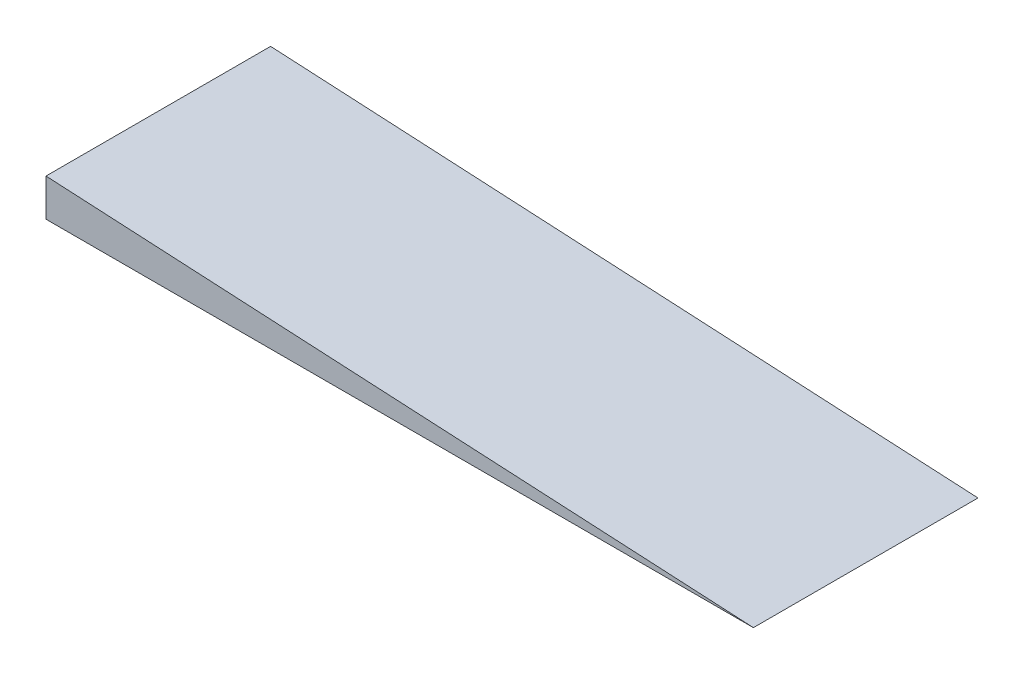
ISO-10303-21;
HEADER;
FILE_DESCRIPTION(('STEP AP214'),'2;1');
FILE_NAME('part.step','',(''),(''),'','','');
FILE_SCHEMA(('AUTOMOTIVE_DESIGN { 1 0 10303 214 1 1 1 1 }'));
ENDSEC;
DATA;
#1=APPLICATION_CONTEXT('core data for automotive mechanical design processes');
#2=APPLICATION_PROTOCOL_DEFINITION('international standard','automotive_design',2000,#1);
#3=PRODUCT_CONTEXT('',#1,'mechanical');
#4=PRODUCT('Part','Part','',(#3));
#5=PRODUCT_RELATED_PRODUCT_CATEGORY('part','',(#4));
#6=PRODUCT_DEFINITION_FORMATION('','',#4);
#7=PRODUCT_DEFINITION_CONTEXT('part definition',#1,'design');
#8=PRODUCT_DEFINITION('design','',#6,#7);
#9=PRODUCT_DEFINITION_SHAPE('','',#8);
#10=(LENGTH_UNIT() NAMED_UNIT(*) SI_UNIT(.MILLI.,.METRE.));
#11=(NAMED_UNIT(*) PLANE_ANGLE_UNIT() SI_UNIT($,.RADIAN.));
#12=(NAMED_UNIT(*) SI_UNIT($,.STERADIAN.) SOLID_ANGLE_UNIT());
#13=UNCERTAINTY_MEASURE_WITH_UNIT(LENGTH_MEASURE(1.E-05),#10,'distance_accuracy_value','');
#14=(GEOMETRIC_REPRESENTATION_CONTEXT(3) GLOBAL_UNCERTAINTY_ASSIGNED_CONTEXT((#13)) GLOBAL_UNIT_ASSIGNED_CONTEXT((#10,
#11,#12)) REPRESENTATION_CONTEXT('',''));
#15=CARTESIAN_POINT('',(0.,0.,0.));
#16=DIRECTION('',(0.,0.,1.));
#17=DIRECTION('',(1.,0.,0.));
#18=AXIS2_PLACEMENT_3D('',#15,#16,#17);
#19=CARTESIAN_POINT('',(0.,3.175,19.05));
#20=DIRECTION('',(1.,0.,0.));
#21=DIRECTION('',(0.,1.,0.));
#22=AXIS2_PLACEMENT_3D('',#19,#20,#21);
#23=PLANE('',#22);
#24=DIRECTION('',(0.,-1.,0.));
#25=VECTOR('',#24,1.);
#26=CARTESIAN_POINT('',(0.,3.175,0.));
#27=LINE('',#26,#25);
#28=CARTESIAN_POINT('',(0.,3.175,0.));
#29=VERTEX_POINT('',#28);
#30=CARTESIAN_POINT('',(0.,0.,0.));
#31=VERTEX_POINT('',#30);
#32=EDGE_CURVE('E95',#29,#31,#27,.T.);
#33=ORIENTED_EDGE('',*,*,#32,.T.);
#34=DIRECTION('',(0.,0.,-1.));
#35=VECTOR('',#34,1.);
#36=CARTESIAN_POINT('',(0.,0.,19.05));
#37=LINE('',#36,#35);
#38=CARTESIAN_POINT('',(0.,0.,19.05));
#39=VERTEX_POINT('',#38);
#40=EDGE_CURVE('E11',#39,#31,#37,.T.);
#41=ORIENTED_EDGE('',*,*,#40,.F.);
#42=DIRECTION('',(0.,-1.,0.));
#43=VECTOR('',#42,1.);
#44=CARTESIAN_POINT('',(0.,3.175,19.05));
#45=LINE('',#44,#43);
#46=CARTESIAN_POINT('',(0.,3.175,19.05));
#47=VERTEX_POINT('',#46);
#48=EDGE_CURVE('E87',#47,#39,#45,.T.);
#49=ORIENTED_EDGE('',*,*,#48,.F.);
#50=DIRECTION('',(0.,0.,-1.));
#51=VECTOR('',#50,1.);
#52=CARTESIAN_POINT('',(0.,3.175,19.05));
#53=LINE('',#52,#51);
#54=EDGE_CURVE('E96',#47,#29,#53,.T.);
#55=ORIENTED_EDGE('',*,*,#54,.T.);
#56=EDGE_LOOP('',(#33,#41,#49,#55));
#57=FACE_BOUND('',#56,.T.);
#58=ADVANCED_FACE('F45',(#57),#23,.F.);
#59=CARTESIAN_POINT('',(0.,0.,19.05));
#60=DIRECTION('',(0.,1.,0.));
#61=DIRECTION('',(0.,0.,1.));
#62=AXIS2_PLACEMENT_3D('',#59,#60,#61);
#63=PLANE('',#62);
#64=DIRECTION('',(1.,0.,0.));
#65=VECTOR('',#64,1.);
#66=CARTESIAN_POINT('',(0.,0.,0.));
#67=LINE('',#66,#65);
#68=CARTESIAN_POINT('',(60.,0.,0.));
#69=VERTEX_POINT('',#68);
#70=EDGE_CURVE('E74',#31,#69,#67,.T.);
#71=ORIENTED_EDGE('',*,*,#70,.T.);
#72=DIRECTION('',(0.,0.,-1.));
#73=VECTOR('',#72,1.);
#74=CARTESIAN_POINT('',(60.,0.,19.05));
#75=LINE('',#74,#73);
#76=CARTESIAN_POINT('',(60.,0.,19.05));
#77=VERTEX_POINT('',#76);
#78=EDGE_CURVE('E54',#77,#69,#75,.T.);
#79=ORIENTED_EDGE('',*,*,#78,.F.);
#80=DIRECTION('',(1.,0.,0.));
#81=VECTOR('',#80,1.);
#82=CARTESIAN_POINT('',(0.,0.,19.05));
#83=LINE('',#82,#81);
#84=EDGE_CURVE('E82',#39,#77,#83,.T.);
#85=ORIENTED_EDGE('',*,*,#84,.F.);
#86=ORIENTED_EDGE('',*,*,#40,.T.);
#87=EDGE_LOOP('',(#71,#79,#85,#86));
#88=FACE_BOUND('',#87,.T.);
#89=ADVANCED_FACE('F83',(#88),#63,.F.);
#90=CARTESIAN_POINT('',(60.,0.,19.05));
#91=DIRECTION('',(-0.0528427339719773,-0.998602846714532,0.));
#92=DIRECTION('',(0.998602846714532,-0.0528427339719773,0.));
#93=AXIS2_PLACEMENT_3D('',#90,#91,#92);
#94=PLANE('',#93);
#95=DIRECTION('',(-0.998602846714532,0.0528427339719773,0.));
#96=VECTOR('',#95,1.);
#97=CARTESIAN_POINT('',(60.,0.,0.));
#98=LINE('',#97,#96);
#99=EDGE_CURVE('E79',#69,#29,#98,.T.);
#100=ORIENTED_EDGE('',*,*,#99,.T.);
#101=ORIENTED_EDGE('',*,*,#54,.F.);
#102=DIRECTION('',(-0.998602846714532,0.0528427339719773,0.));
#103=VECTOR('',#102,1.);
#104=CARTESIAN_POINT('',(60.,0.,19.05));
#105=LINE('',#104,#103);
#106=EDGE_CURVE('E62',#77,#47,#105,.T.);
#107=ORIENTED_EDGE('',*,*,#106,.F.);
#108=ORIENTED_EDGE('',*,*,#78,.T.);
#109=EDGE_LOOP('',(#100,#101,#107,#108));
#110=FACE_BOUND('',#109,.T.);
#111=ADVANCED_FACE('F108',(#110),#94,.F.);
#112=CARTESIAN_POINT('',(0.,0.,19.05));
#113=DIRECTION('',(0.,0.,1.));
#114=DIRECTION('',(1.,0.,0.));
#115=AXIS2_PLACEMENT_3D('',#112,#113,#114);
#116=PLANE('',#115);
#117=ORIENTED_EDGE('',*,*,#48,.T.);
#118=ORIENTED_EDGE('',*,*,#84,.T.);
#119=ORIENTED_EDGE('',*,*,#106,.T.);
#120=EDGE_LOOP('',(#117,#118,#119));
#121=FACE_BOUND('',#120,.T.);
#122=ADVANCED_FACE('F90',(#121),#116,.T.);
#123=CARTESIAN_POINT('',(0.,0.,0.));
#124=DIRECTION('',(0.,0.,1.));
#125=DIRECTION('',(1.,0.,0.));
#126=AXIS2_PLACEMENT_3D('',#123,#124,#125);
#127=PLANE('',#126);
#128=ORIENTED_EDGE('',*,*,#32,.F.);
#129=ORIENTED_EDGE('',*,*,#99,.F.);
#130=ORIENTED_EDGE('',*,*,#70,.F.);
#131=EDGE_LOOP('',(#128,#129,#130));
#132=FACE_BOUND('',#131,.T.);
#133=ADVANCED_FACE('F109',(#132),#127,.F.);
#134=CLOSED_SHELL('',(#58,#89,#111,#122,#133));
#135=MANIFOLD_SOLID_BREP('B2',#134);
#136=ADVANCED_BREP_SHAPE_REPRESENTATION('',(#18,#135),#14);
#137=SHAPE_DEFINITION_REPRESENTATION(#9,#136);
ENDSEC;
END-ISO-10303-21;
